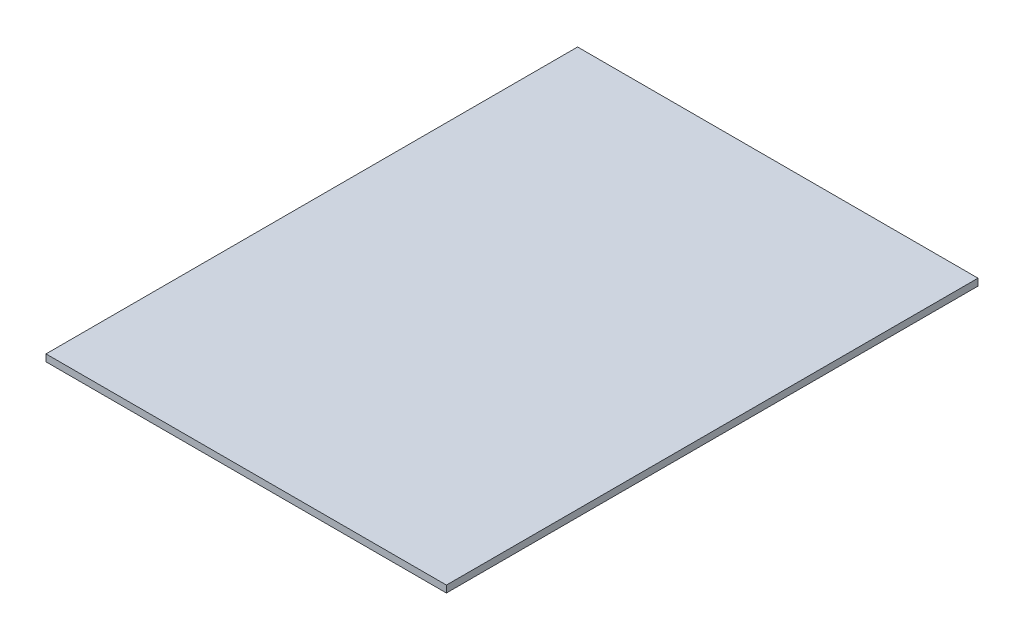
ISO-10303-21;
HEADER;
FILE_DESCRIPTION(('STEP AP214'),'2;1');
FILE_NAME('part.step','',(''),(''),'','','');
FILE_SCHEMA(('AUTOMOTIVE_DESIGN { 1 0 10303 214 1 1 1 1 }'));
ENDSEC;
DATA;
#1=APPLICATION_CONTEXT('core data for automotive mechanical design processes');
#2=APPLICATION_PROTOCOL_DEFINITION('international standard','automotive_design',2000,#1);
#3=PRODUCT_CONTEXT('',#1,'mechanical');
#4=PRODUCT('Part','Part','',(#3));
#5=PRODUCT_RELATED_PRODUCT_CATEGORY('part','',(#4));
#6=PRODUCT_DEFINITION_FORMATION('','',#4);
#7=PRODUCT_DEFINITION_CONTEXT('part definition',#1,'design');
#8=PRODUCT_DEFINITION('design','',#6,#7);
#9=PRODUCT_DEFINITION_SHAPE('','',#8);
#10=(LENGTH_UNIT() NAMED_UNIT(*) SI_UNIT(.MILLI.,.METRE.));
#11=(NAMED_UNIT(*) PLANE_ANGLE_UNIT() SI_UNIT($,.RADIAN.));
#12=(NAMED_UNIT(*) SI_UNIT($,.STERADIAN.) SOLID_ANGLE_UNIT());
#13=UNCERTAINTY_MEASURE_WITH_UNIT(LENGTH_MEASURE(1.E-05),#10,'distance_accuracy_value','');
#14=(GEOMETRIC_REPRESENTATION_CONTEXT(3) GLOBAL_UNCERTAINTY_ASSIGNED_CONTEXT((#13)) GLOBAL_UNIT_ASSIGNED_CONTEXT((#10,
#11,#12)) REPRESENTATION_CONTEXT('',''));
#15=CARTESIAN_POINT('',(0.,0.,0.));
#16=DIRECTION('',(0.,0.,1.));
#17=DIRECTION('',(1.,0.,0.));
#18=AXIS2_PLACEMENT_3D('',#15,#16,#17);
#19=CARTESIAN_POINT('',(-29.,0.999999999999997,38.5));
#20=DIRECTION('',(1.,0.,0.));
#21=DIRECTION('',(0.,0.,-1.));
#22=AXIS2_PLACEMENT_3D('',#19,#20,#21);
#23=PLANE('',#22);
#24=DIRECTION('',(0.,0.,1.));
#25=VECTOR('',#24,1.);
#26=CARTESIAN_POINT('',(-29.,0.,38.5));
#27=LINE('',#26,#25);
#28=CARTESIAN_POINT('',(-29.,0.,-38.5));
#29=VERTEX_POINT('',#28);
#30=CARTESIAN_POINT('',(-29.,0.,38.5));
#31=VERTEX_POINT('',#30);
#32=EDGE_CURVE('E111',#29,#31,#27,.T.);
#33=ORIENTED_EDGE('',*,*,#32,.T.);
#34=DIRECTION('',(0.,-1.,0.));
#35=VECTOR('',#34,1.);
#36=CARTESIAN_POINT('',(-29.,0.999999999999997,38.5));
#37=LINE('',#36,#35);
#38=CARTESIAN_POINT('',(-29.,0.999999999999997,38.5));
#39=VERTEX_POINT('',#38);
#40=EDGE_CURVE('E11',#39,#31,#37,.T.);
#41=ORIENTED_EDGE('',*,*,#40,.F.);
#42=DIRECTION('',(0.,0.,1.));
#43=VECTOR('',#42,1.);
#44=CARTESIAN_POINT('',(-29.,0.999999999999997,38.5));
#45=LINE('',#44,#43);
#46=CARTESIAN_POINT('',(-29.,0.999999999999997,-38.5));
#47=VERTEX_POINT('',#46);
#48=EDGE_CURVE('E95',#47,#39,#45,.T.);
#49=ORIENTED_EDGE('',*,*,#48,.F.);
#50=DIRECTION('',(0.,-1.,0.));
#51=VECTOR('',#50,1.);
#52=CARTESIAN_POINT('',(-29.,0.999999999999997,-38.5));
#53=LINE('',#52,#51);
#54=EDGE_CURVE('E107',#47,#29,#53,.T.);
#55=ORIENTED_EDGE('',*,*,#54,.T.);
#56=EDGE_LOOP('',(#33,#41,#49,#55));
#57=FACE_BOUND('',#56,.T.);
#58=ADVANCED_FACE('F43',(#57),#23,.F.);
#59=CARTESIAN_POINT('',(29.,0.999999999999997,38.5));
#60=DIRECTION('',(0.,0.,-1.));
#61=DIRECTION('',(-1.,0.,0.));
#62=AXIS2_PLACEMENT_3D('',#59,#60,#61);
#63=PLANE('',#62);
#64=DIRECTION('',(1.,0.,0.));
#65=VECTOR('',#64,1.);
#66=CARTESIAN_POINT('',(29.,0.,38.5));
#67=LINE('',#66,#65);
#68=CARTESIAN_POINT('',(29.,0.,38.5));
#69=VERTEX_POINT('',#68);
#70=EDGE_CURVE('E100',#31,#69,#67,.T.);
#71=ORIENTED_EDGE('',*,*,#70,.T.);
#72=DIRECTION('',(0.,-1.,0.));
#73=VECTOR('',#72,1.);
#74=CARTESIAN_POINT('',(29.,0.999999999999997,38.5));
#75=LINE('',#74,#73);
#76=CARTESIAN_POINT('',(29.,0.999999999999997,38.5));
#77=VERTEX_POINT('',#76);
#78=EDGE_CURVE('E52',#77,#69,#75,.T.);
#79=ORIENTED_EDGE('',*,*,#78,.F.);
#80=DIRECTION('',(1.,0.,0.));
#81=VECTOR('',#80,1.);
#82=CARTESIAN_POINT('',(29.,0.999999999999997,38.5));
#83=LINE('',#82,#81);
#84=EDGE_CURVE('E90',#39,#77,#83,.T.);
#85=ORIENTED_EDGE('',*,*,#84,.F.);
#86=ORIENTED_EDGE('',*,*,#40,.T.);
#87=EDGE_LOOP('',(#71,#79,#85,#86));
#88=FACE_BOUND('',#87,.T.);
#89=ADVANCED_FACE('F99',(#88),#63,.F.);
#90=CARTESIAN_POINT('',(29.,0.999999999999997,38.5));
#91=DIRECTION('',(-1.,0.,0.));
#92=DIRECTION('',(0.,0.,1.));
#93=AXIS2_PLACEMENT_3D('',#90,#91,#92);
#94=PLANE('',#93);
#95=DIRECTION('',(0.,0.,-1.));
#96=VECTOR('',#95,1.);
#97=CARTESIAN_POINT('',(29.,0.,38.5));
#98=LINE('',#97,#96);
#99=CARTESIAN_POINT('',(29.,0.,-38.5));
#100=VERTEX_POINT('',#99);
#101=EDGE_CURVE('E77',#69,#100,#98,.T.);
#102=ORIENTED_EDGE('',*,*,#101,.T.);
#103=DIRECTION('',(0.,-1.,0.));
#104=VECTOR('',#103,1.);
#105=CARTESIAN_POINT('',(29.,0.999999999999997,-38.5));
#106=LINE('',#105,#104);
#107=CARTESIAN_POINT('',(29.,0.999999999999997,-38.5));
#108=VERTEX_POINT('',#107);
#109=EDGE_CURVE('E102',#108,#100,#106,.T.);
#110=ORIENTED_EDGE('',*,*,#109,.F.);
#111=DIRECTION('',(0.,0.,-1.));
#112=VECTOR('',#111,1.);
#113=CARTESIAN_POINT('',(29.,0.999999999999997,38.5));
#114=LINE('',#113,#112);
#115=EDGE_CURVE('E93',#77,#108,#114,.T.);
#116=ORIENTED_EDGE('',*,*,#115,.F.);
#117=ORIENTED_EDGE('',*,*,#78,.T.);
#118=EDGE_LOOP('',(#102,#110,#116,#117));
#119=FACE_BOUND('',#118,.T.);
#120=ADVANCED_FACE('F103',(#119),#94,.F.);
#121=CARTESIAN_POINT('',(29.,0.999999999999997,-38.5));
#122=DIRECTION('',(0.,0.,1.));
#123=DIRECTION('',(1.,0.,0.));
#124=AXIS2_PLACEMENT_3D('',#121,#122,#123);
#125=PLANE('',#124);
#126=DIRECTION('',(-1.,0.,0.));
#127=VECTOR('',#126,1.);
#128=CARTESIAN_POINT('',(29.,0.,-38.5));
#129=LINE('',#128,#127);
#130=EDGE_CURVE('E83',#100,#29,#129,.T.);
#131=ORIENTED_EDGE('',*,*,#130,.T.);
#132=ORIENTED_EDGE('',*,*,#54,.F.);
#133=DIRECTION('',(-1.,0.,0.));
#134=VECTOR('',#133,1.);
#135=CARTESIAN_POINT('',(29.,0.999999999999997,-38.5));
#136=LINE('',#135,#134);
#137=EDGE_CURVE('E60',#108,#47,#136,.T.);
#138=ORIENTED_EDGE('',*,*,#137,.F.);
#139=ORIENTED_EDGE('',*,*,#109,.T.);
#140=EDGE_LOOP('',(#131,#132,#138,#139));
#141=FACE_BOUND('',#140,.T.);
#142=ADVANCED_FACE('F124',(#141),#125,.F.);
#143=CARTESIAN_POINT('',(0.,0.999999999999997,0.));
#144=DIRECTION('',(0.,1.,0.));
#145=DIRECTION('',(0.,0.,1.));
#146=AXIS2_PLACEMENT_3D('',#143,#144,#145);
#147=PLANE('',#146);
#148=ORIENTED_EDGE('',*,*,#48,.T.);
#149=ORIENTED_EDGE('',*,*,#84,.T.);
#150=ORIENTED_EDGE('',*,*,#115,.T.);
#151=ORIENTED_EDGE('',*,*,#137,.T.);
#152=EDGE_LOOP('',(#148,#149,#150,#151));
#153=FACE_BOUND('',#152,.T.);
#154=ADVANCED_FACE('F91',(#153),#147,.T.);
#155=CARTESIAN_POINT('',(0.,0.,0.));
#156=DIRECTION('',(0.,1.,0.));
#157=DIRECTION('',(0.,0.,1.));
#158=AXIS2_PLACEMENT_3D('',#155,#156,#157);
#159=PLANE('',#158);
#160=ORIENTED_EDGE('',*,*,#32,.F.);
#161=ORIENTED_EDGE('',*,*,#130,.F.);
#162=ORIENTED_EDGE('',*,*,#101,.F.);
#163=ORIENTED_EDGE('',*,*,#70,.F.);
#164=EDGE_LOOP('',(#160,#161,#162,#163));
#165=FACE_BOUND('',#164,.T.);
#166=ADVANCED_FACE('F127',(#165),#159,.F.);
#167=CLOSED_SHELL('',(#58,#89,#120,#142,#154,#166));
#168=MANIFOLD_SOLID_BREP('B2',#167);
#169=ADVANCED_BREP_SHAPE_REPRESENTATION('',(#18,#168),#14);
#170=SHAPE_DEFINITION_REPRESENTATION(#9,#169);
ENDSEC;
END-ISO-10303-21;
